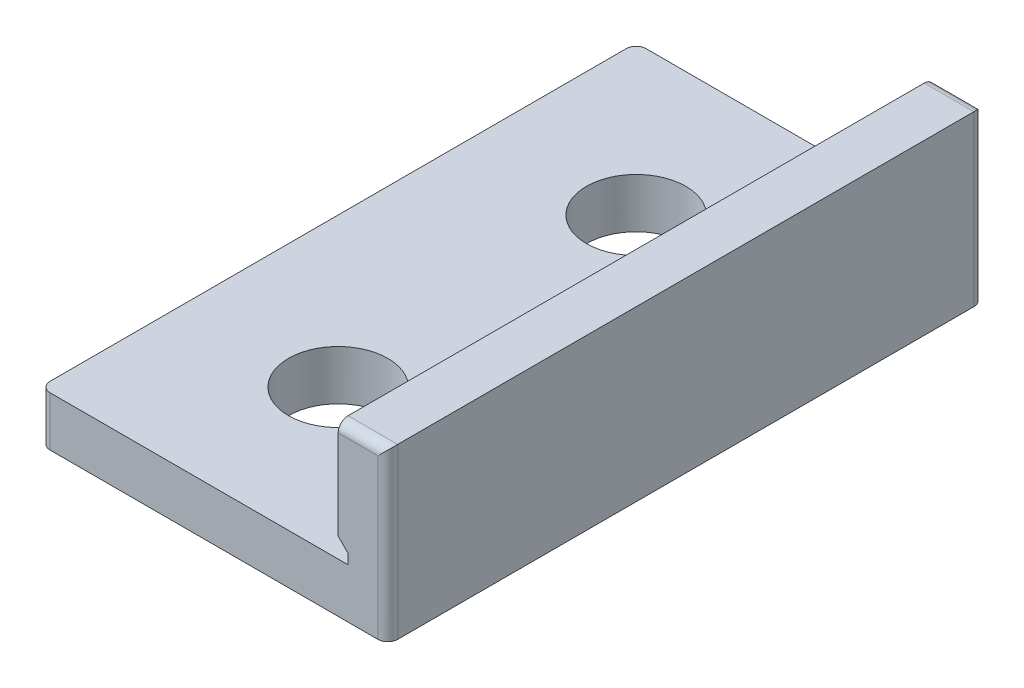
ISO-10303-21;
HEADER;
FILE_DESCRIPTION(('STEP AP214'),'2;1');
FILE_NAME('part.step','',(''),(''),'','','');
FILE_SCHEMA(('AUTOMOTIVE_DESIGN { 1 0 10303 214 1 1 1 1 }'));
ENDSEC;
DATA;
#1=APPLICATION_CONTEXT('core data for automotive mechanical design processes');
#2=APPLICATION_PROTOCOL_DEFINITION('international standard','automotive_design',2000,#1);
#3=PRODUCT_CONTEXT('',#1,'mechanical');
#4=PRODUCT('Part','Part','',(#3));
#5=PRODUCT_RELATED_PRODUCT_CATEGORY('part','',(#4));
#6=PRODUCT_DEFINITION_FORMATION('','',#4);
#7=PRODUCT_DEFINITION_CONTEXT('part definition',#1,'design');
#8=PRODUCT_DEFINITION('design','',#6,#7);
#9=PRODUCT_DEFINITION_SHAPE('','',#8);
#10=(LENGTH_UNIT() NAMED_UNIT(*) SI_UNIT(.MILLI.,.METRE.));
#11=(NAMED_UNIT(*) PLANE_ANGLE_UNIT() SI_UNIT($,.RADIAN.));
#12=(NAMED_UNIT(*) SI_UNIT($,.STERADIAN.) SOLID_ANGLE_UNIT());
#13=UNCERTAINTY_MEASURE_WITH_UNIT(LENGTH_MEASURE(1.E-05),#10,'distance_accuracy_value','');
#14=(GEOMETRIC_REPRESENTATION_CONTEXT(3) GLOBAL_UNCERTAINTY_ASSIGNED_CONTEXT((#13)) GLOBAL_UNIT_ASSIGNED_CONTEXT((#10,
#11,#12)) REPRESENTATION_CONTEXT('',''));
#15=CARTESIAN_POINT('',(0.,0.,0.));
#16=DIRECTION('',(0.,0.,1.));
#17=DIRECTION('',(1.,0.,0.));
#18=AXIS2_PLACEMENT_3D('',#15,#16,#17);
#19=CARTESIAN_POINT('',(35.,0.,30.));
#20=DIRECTION('',(-1.,0.,0.));
#21=DIRECTION('',(0.,0.,1.));
#22=AXIS2_PLACEMENT_3D('',#19,#20,#21);
#23=PLANE('',#22);
#24=DIRECTION('',(0.,0.,-1.));
#25=VECTOR('',#24,1.);
#26=CARTESIAN_POINT('',(35.,12.,30.));
#27=LINE('',#26,#25);
#28=CARTESIAN_POINT('',(35.,12.,29.));
#29=VERTEX_POINT('',#28);
#30=CARTESIAN_POINT('',(35.,12.,-29.));
#31=VERTEX_POINT('',#30);
#32=EDGE_CURVE('E187',#29,#31,#27,.T.);
#33=ORIENTED_EDGE('',*,*,#32,.F.);
#34=DIRECTION('',(0.,1.,0.));
#35=VECTOR('',#34,1.);
#36=CARTESIAN_POINT('',(35.,0.,29.));
#37=LINE('',#36,#35);
#38=CARTESIAN_POINT('',(35.,-5.,29.));
#39=VERTEX_POINT('',#38);
#40=EDGE_CURVE('E198',#29,#39,#37,.F.);
#41=ORIENTED_EDGE('',*,*,#40,.T.);
#42=DIRECTION('',(0.,0.,-1.));
#43=VECTOR('',#42,1.);
#44=CARTESIAN_POINT('',(35.,-5.,30.));
#45=LINE('',#44,#43);
#46=CARTESIAN_POINT('',(35.,-5.,-29.));
#47=VERTEX_POINT('',#46);
#48=EDGE_CURVE('E174',#39,#47,#45,.T.);
#49=ORIENTED_EDGE('',*,*,#48,.T.);
#50=DIRECTION('',(0.,1.,0.));
#51=VECTOR('',#50,1.);
#52=CARTESIAN_POINT('',(35.,12.,-29.));
#53=LINE('',#52,#51);
#54=EDGE_CURVE('E195',#47,#31,#53,.T.);
#55=ORIENTED_EDGE('',*,*,#54,.T.);
#56=EDGE_LOOP('',(#33,#41,#49,#55));
#57=FACE_BOUND('',#56,.T.);
#58=ADVANCED_FACE('F37',(#57),#23,.F.);
#59=CARTESIAN_POINT('',(30.,12.,30.));
#60=DIRECTION('',(0.,1.,0.));
#61=DIRECTION('',(0.,0.,1.));
#62=AXIS2_PLACEMENT_3D('',#59,#60,#61);
#63=PLANE('',#62);
#64=DIRECTION('',(0.,0.,-1.));
#65=VECTOR('',#64,1.);
#66=CARTESIAN_POINT('',(30.,12.,30.));
#67=LINE('',#66,#65);
#68=CARTESIAN_POINT('',(30.,12.,29.));
#69=VERTEX_POINT('',#68);
#70=CARTESIAN_POINT('',(30.,12.,-29.));
#71=VERTEX_POINT('',#70);
#72=EDGE_CURVE('E184',#69,#71,#67,.T.);
#73=ORIENTED_EDGE('',*,*,#72,.F.);
#74=DIRECTION('',(1.,0.,0.));
#75=VECTOR('',#74,1.);
#76=CARTESIAN_POINT('',(35.,12.,29.));
#77=LINE('',#76,#75);
#78=EDGE_CURVE('E217',#69,#29,#77,.T.);
#79=ORIENTED_EDGE('',*,*,#78,.T.);
#80=ORIENTED_EDGE('',*,*,#32,.T.);
#81=DIRECTION('',(1.,0.,0.));
#82=VECTOR('',#81,1.);
#83=CARTESIAN_POINT('',(30.,12.,-29.));
#84=LINE('',#83,#82);
#85=EDGE_CURVE('E215',#31,#71,#84,.F.);
#86=ORIENTED_EDGE('',*,*,#85,.T.);
#87=EDGE_LOOP('',(#73,#79,#80,#86));
#88=FACE_BOUND('',#87,.T.);
#89=ADVANCED_FACE('F251',(#88),#63,.T.);
#90=CARTESIAN_POINT('',(30.,0.,30.));
#91=DIRECTION('',(-1.,0.,0.));
#92=DIRECTION('',(0.,0.,1.));
#93=AXIS2_PLACEMENT_3D('',#90,#91,#92);
#94=PLANE('',#93);
#95=DIRECTION('',(0.,1.,0.));
#96=VECTOR('',#95,1.);
#97=CARTESIAN_POINT('',(30.,0.,30.));
#98=LINE('',#97,#96);
#99=CARTESIAN_POINT('',(30.,2.,30.));
#100=VERTEX_POINT('',#99);
#101=CARTESIAN_POINT('',(30.,11.,30.));
#102=VERTEX_POINT('',#101);
#103=EDGE_CURVE('E150',#100,#102,#98,.T.);
#104=ORIENTED_EDGE('',*,*,#103,.T.);
#105=CARTESIAN_POINT('',(30.,11.,29.));
#106=DIRECTION('',(-1.,0.,0.));
#107=DIRECTION('',(0.,0.,1.));
#108=AXIS2_PLACEMENT_3D('',#105,#106,#107);
#109=CIRCLE('',#108,1.);
#110=EDGE_CURVE('E221',#102,#69,#109,.T.);
#111=ORIENTED_EDGE('',*,*,#110,.T.);
#112=ORIENTED_EDGE('',*,*,#72,.T.);
#113=CARTESIAN_POINT('',(30.,11.,-29.));
#114=DIRECTION('',(-1.,0.,0.));
#115=DIRECTION('',(0.,0.,1.));
#116=AXIS2_PLACEMENT_3D('',#113,#114,#115);
#117=CIRCLE('',#116,1.);
#118=CARTESIAN_POINT('',(30.,11.,-30.));
#119=VERTEX_POINT('',#118);
#120=EDGE_CURVE('E219',#71,#119,#117,.T.);
#121=ORIENTED_EDGE('',*,*,#120,.T.);
#122=DIRECTION('',(0.,1.,0.));
#123=VECTOR('',#122,1.);
#124=CARTESIAN_POINT('',(30.,0.,-30.));
#125=LINE('',#124,#123);
#126=CARTESIAN_POINT('',(30.,1.99999999999999,-30.));
#127=VERTEX_POINT('',#126);
#128=EDGE_CURVE('E153',#127,#119,#125,.T.);
#129=ORIENTED_EDGE('',*,*,#128,.F.);
#130=DIRECTION('',(0.,0.,-1.));
#131=VECTOR('',#130,1.);
#132=CARTESIAN_POINT('',(30.,2.,30.001));
#133=LINE('',#132,#131);
#134=EDGE_CURVE('E136',#100,#127,#133,.T.);
#135=ORIENTED_EDGE('',*,*,#134,.F.);
#136=EDGE_LOOP('',(#104,#111,#112,#121,#129,#135));
#137=FACE_BOUND('',#136,.T.);
#138=ADVANCED_FACE('F149',(#137),#94,.T.);
#139=CARTESIAN_POINT('',(0.,0.,30.));
#140=DIRECTION('',(0.,1.,0.));
#141=DIRECTION('',(0.,0.,1.));
#142=AXIS2_PLACEMENT_3D('',#139,#140,#141);
#143=PLANE('',#142);
#144=CARTESIAN_POINT('',(15.,0.,-15.));
#145=DIRECTION('',(0.,1.,0.));
#146=DIRECTION('',(0.,0.,1.));
#147=AXIS2_PLACEMENT_3D('',#144,#145,#146);
#148=CIRCLE('',#147,5.);
#149=CARTESIAN_POINT('',(15.,0.,-10.));
#150=VERTEX_POINT('',#149);
#151=EDGE_CURVE('E287',#150,#150,#148,.T.);
#152=ORIENTED_EDGE('',*,*,#151,.F.);
#153=EDGE_LOOP('',(#152));
#154=FACE_BOUND('',#153,.T.);
#155=CARTESIAN_POINT('',(15.,0.,15.));
#156=DIRECTION('',(0.,1.,0.));
#157=DIRECTION('',(0.,0.,1.));
#158=AXIS2_PLACEMENT_3D('',#155,#156,#157);
#159=CIRCLE('',#158,5.);
#160=CARTESIAN_POINT('',(15.,0.,20.));
#161=VERTEX_POINT('',#160);
#162=EDGE_CURVE('E170',#161,#161,#159,.T.);
#163=ORIENTED_EDGE('',*,*,#162,.F.);
#164=EDGE_LOOP('',(#163));
#165=FACE_BOUND('',#164,.T.);
#166=DIRECTION('',(0.,0.,-1.));
#167=VECTOR('',#166,1.);
#168=CARTESIAN_POINT('',(0.,0.,30.));
#169=LINE('',#168,#167);
#170=CARTESIAN_POINT('',(0.,0.,29.));
#171=VERTEX_POINT('',#170);
#172=CARTESIAN_POINT('',(0.,0.,-29.));
#173=VERTEX_POINT('',#172);
#174=EDGE_CURVE('E182',#171,#173,#169,.T.);
#175=ORIENTED_EDGE('',*,*,#174,.F.);
#176=CARTESIAN_POINT('',(1.,0.,29.));
#177=DIRECTION('',(0.,1.,0.));
#178=DIRECTION('',(0.,0.,1.));
#179=AXIS2_PLACEMENT_3D('',#176,#177,#178);
#180=CIRCLE('',#179,1.);
#181=CARTESIAN_POINT('',(1.,0.,30.));
#182=VERTEX_POINT('',#181);
#183=EDGE_CURVE('E11',#171,#182,#180,.T.);
#184=ORIENTED_EDGE('',*,*,#183,.T.);
#185=DIRECTION('',(1.,0.,0.));
#186=VECTOR('',#185,1.);
#187=CARTESIAN_POINT('',(0.,0.,30.));
#188=LINE('',#187,#186);
#189=CARTESIAN_POINT('',(31.,0.,30.));
#190=VERTEX_POINT('',#189);
#191=EDGE_CURVE('E161',#182,#190,#188,.T.);
#192=ORIENTED_EDGE('',*,*,#191,.T.);
#193=DIRECTION('',(0.,0.,-1.));
#194=VECTOR('',#193,1.);
#195=CARTESIAN_POINT('',(31.,0.,30.001));
#196=LINE('',#195,#194);
#197=CARTESIAN_POINT('',(31.,0.,-30.));
#198=VERTEX_POINT('',#197);
#199=EDGE_CURVE('E144',#190,#198,#196,.T.);
#200=ORIENTED_EDGE('',*,*,#199,.T.);
#201=DIRECTION('',(1.,0.,0.));
#202=VECTOR('',#201,1.);
#203=CARTESIAN_POINT('',(0.,0.,-30.));
#204=LINE('',#203,#202);
#205=CARTESIAN_POINT('',(1.,0.,-30.));
#206=VERTEX_POINT('',#205);
#207=EDGE_CURVE('E167',#206,#198,#204,.T.);
#208=ORIENTED_EDGE('',*,*,#207,.F.);
#209=CARTESIAN_POINT('',(1.,0.,-29.));
#210=DIRECTION('',(0.,1.,0.));
#211=DIRECTION('',(0.,0.,1.));
#212=AXIS2_PLACEMENT_3D('',#209,#210,#211);
#213=CIRCLE('',#212,1.);
#214=EDGE_CURVE('E46',#206,#173,#213,.T.);
#215=ORIENTED_EDGE('',*,*,#214,.T.);
#216=EDGE_LOOP('',(#175,#184,#192,#200,#208,#215));
#217=FACE_BOUND('',#216,.T.);
#218=ADVANCED_FACE('F272',(#154,#165,#217),#143,.T.);
#219=CARTESIAN_POINT('',(0.,-5.,30.));
#220=DIRECTION('',(-1.,0.,0.));
#221=DIRECTION('',(0.,0.,1.));
#222=AXIS2_PLACEMENT_3D('',#219,#220,#221);
#223=PLANE('',#222);
#224=DIRECTION('',(0.,0.,-1.));
#225=VECTOR('',#224,1.);
#226=CARTESIAN_POINT('',(0.,-5.,30.));
#227=LINE('',#226,#225);
#228=CARTESIAN_POINT('',(0.,-5.,29.));
#229=VERTEX_POINT('',#228);
#230=CARTESIAN_POINT('',(0.,-5.,-29.));
#231=VERTEX_POINT('',#230);
#232=EDGE_CURVE('E179',#229,#231,#227,.T.);
#233=ORIENTED_EDGE('',*,*,#232,.F.);
#234=DIRECTION('',(0.,1.,0.));
#235=VECTOR('',#234,1.);
#236=CARTESIAN_POINT('',(0.,0.,29.));
#237=LINE('',#236,#235);
#238=EDGE_CURVE('E225',#229,#171,#237,.T.);
#239=ORIENTED_EDGE('',*,*,#238,.T.);
#240=ORIENTED_EDGE('',*,*,#174,.T.);
#241=DIRECTION('',(0.,1.,0.));
#242=VECTOR('',#241,1.);
#243=CARTESIAN_POINT('',(0.,-5.,-29.));
#244=LINE('',#243,#242);
#245=EDGE_CURVE('E223',#173,#231,#244,.F.);
#246=ORIENTED_EDGE('',*,*,#245,.T.);
#247=EDGE_LOOP('',(#233,#239,#240,#246));
#248=FACE_BOUND('',#247,.T.);
#249=ADVANCED_FACE('F270',(#248),#223,.T.);
#250=CARTESIAN_POINT('',(0.,-5.,30.));
#251=DIRECTION('',(0.,1.,0.));
#252=DIRECTION('',(0.,0.,1.));
#253=AXIS2_PLACEMENT_3D('',#250,#251,#252);
#254=PLANE('',#253);
#255=CARTESIAN_POINT('',(15.,-5.,-15.));
#256=DIRECTION('',(0.,-1.,0.));
#257=DIRECTION('',(0.,0.,-1.));
#258=AXIS2_PLACEMENT_3D('',#255,#256,#257);
#259=CIRCLE('',#258,5.);
#260=CARTESIAN_POINT('',(15.,-5.,-20.));
#261=VERTEX_POINT('',#260);
#262=EDGE_CURVE('E143',#261,#261,#259,.T.);
#263=ORIENTED_EDGE('',*,*,#262,.F.);
#264=EDGE_LOOP('',(#263));
#265=FACE_BOUND('',#264,.T.);
#266=CARTESIAN_POINT('',(15.,-5.,15.));
#267=DIRECTION('',(0.,-1.,0.));
#268=DIRECTION('',(0.,0.,-1.));
#269=AXIS2_PLACEMENT_3D('',#266,#267,#268);
#270=CIRCLE('',#269,5.);
#271=CARTESIAN_POINT('',(15.,-5.,10.));
#272=VERTEX_POINT('',#271);
#273=EDGE_CURVE('E289',#272,#272,#270,.T.);
#274=ORIENTED_EDGE('',*,*,#273,.F.);
#275=EDGE_LOOP('',(#274));
#276=FACE_BOUND('',#275,.T.);
#277=ORIENTED_EDGE('',*,*,#48,.F.);
#278=CARTESIAN_POINT('',(34.,-5.,29.));
#279=DIRECTION('',(0.,1.,0.));
#280=DIRECTION('',(0.,0.,1.));
#281=AXIS2_PLACEMENT_3D('',#278,#279,#280);
#282=CIRCLE('',#281,1.);
#283=CARTESIAN_POINT('',(34.,-5.,30.));
#284=VERTEX_POINT('',#283);
#285=EDGE_CURVE('E206',#39,#284,#282,.F.);
#286=ORIENTED_EDGE('',*,*,#285,.T.);
#287=DIRECTION('',(1.,0.,0.));
#288=VECTOR('',#287,1.);
#289=CARTESIAN_POINT('',(0.,-5.,30.));
#290=LINE('',#289,#288);
#291=CARTESIAN_POINT('',(1.,-5.,30.));
#292=VERTEX_POINT('',#291);
#293=EDGE_CURVE('E164',#292,#284,#290,.T.);
#294=ORIENTED_EDGE('',*,*,#293,.F.);
#295=CARTESIAN_POINT('',(1.,-5.,29.));
#296=DIRECTION('',(0.,1.,0.));
#297=DIRECTION('',(0.,0.,1.));
#298=AXIS2_PLACEMENT_3D('',#295,#296,#297);
#299=CIRCLE('',#298,1.);
#300=EDGE_CURVE('E202',#292,#229,#299,.F.);
#301=ORIENTED_EDGE('',*,*,#300,.T.);
#302=ORIENTED_EDGE('',*,*,#232,.T.);
#303=CARTESIAN_POINT('',(1.,-5.,-29.));
#304=DIRECTION('',(0.,1.,0.));
#305=DIRECTION('',(0.,0.,1.));
#306=AXIS2_PLACEMENT_3D('',#303,#304,#305);
#307=CIRCLE('',#306,1.);
#308=CARTESIAN_POINT('',(1.,-5.,-30.));
#309=VERTEX_POINT('',#308);
#310=EDGE_CURVE('E200',#231,#309,#307,.F.);
#311=ORIENTED_EDGE('',*,*,#310,.T.);
#312=DIRECTION('',(1.,0.,0.));
#313=VECTOR('',#312,1.);
#314=CARTESIAN_POINT('',(0.,-5.,-30.));
#315=LINE('',#314,#313);
#316=CARTESIAN_POINT('',(34.,-5.,-30.));
#317=VERTEX_POINT('',#316);
#318=EDGE_CURVE('E162',#309,#317,#315,.T.);
#319=ORIENTED_EDGE('',*,*,#318,.T.);
#320=CARTESIAN_POINT('',(34.,-5.,-29.));
#321=DIRECTION('',(0.,1.,0.));
#322=DIRECTION('',(0.,0.,1.));
#323=AXIS2_PLACEMENT_3D('',#320,#321,#322);
#324=CIRCLE('',#323,1.);
#325=EDGE_CURVE('E204',#317,#47,#324,.F.);
#326=ORIENTED_EDGE('',*,*,#325,.T.);
#327=EDGE_LOOP('',(#277,#286,#294,#301,#302,#311,#319,#326));
#328=FACE_BOUND('',#327,.T.);
#329=ADVANCED_FACE('F259',(#265,#276,#328),#254,.F.);
#330=CARTESIAN_POINT('',(0.,0.,30.));
#331=DIRECTION('',(0.,0.,-1.));
#332=DIRECTION('',(-1.,0.,0.));
#333=AXIS2_PLACEMENT_3D('',#330,#331,#332);
#334=PLANE('',#333);
#335=ORIENTED_EDGE('',*,*,#293,.T.);
#336=DIRECTION('',(0.,1.,0.));
#337=VECTOR('',#336,1.);
#338=CARTESIAN_POINT('',(34.,0.,30.));
#339=LINE('',#338,#337);
#340=CARTESIAN_POINT('',(34.,11.,30.));
#341=VERTEX_POINT('',#340);
#342=EDGE_CURVE('E193',#284,#341,#339,.T.);
#343=ORIENTED_EDGE('',*,*,#342,.T.);
#344=DIRECTION('',(1.,0.,0.));
#345=VECTOR('',#344,1.);
#346=CARTESIAN_POINT('',(30.,11.,30.));
#347=LINE('',#346,#345);
#348=EDGE_CURVE('E160',#341,#102,#347,.F.);
#349=ORIENTED_EDGE('',*,*,#348,.T.);
#350=ORIENTED_EDGE('',*,*,#103,.F.);
#351=DIRECTION('',(-0.707106781186549,0.707106781186546,0.));
#352=VECTOR('',#351,1.);
#353=CARTESIAN_POINT('',(31.,1.,30.));
#354=LINE('',#353,#352);
#355=CARTESIAN_POINT('',(31.,1.,30.));
#356=VERTEX_POINT('',#355);
#357=EDGE_CURVE('E132',#356,#100,#354,.T.);
#358=ORIENTED_EDGE('',*,*,#357,.F.);
#359=DIRECTION('',(0.,1.,0.));
#360=VECTOR('',#359,1.);
#361=CARTESIAN_POINT('',(31.,0.,30.));
#362=LINE('',#361,#360);
#363=EDGE_CURVE('E228',#190,#356,#362,.T.);
#364=ORIENTED_EDGE('',*,*,#363,.F.);
#365=ORIENTED_EDGE('',*,*,#191,.F.);
#366=DIRECTION('',(0.,1.,0.));
#367=VECTOR('',#366,1.);
#368=CARTESIAN_POINT('',(1.,-5.,30.));
#369=LINE('',#368,#367);
#370=EDGE_CURVE('E190',#182,#292,#369,.F.);
#371=ORIENTED_EDGE('',*,*,#370,.T.);
#372=EDGE_LOOP('',(#335,#343,#349,#350,#358,#364,#365,#371));
#373=FACE_BOUND('',#372,.T.);
#374=ADVANCED_FACE('F157',(#373),#334,.F.);
#375=CARTESIAN_POINT('',(0.,0.,-30.));
#376=DIRECTION('',(0.,0.,-1.));
#377=DIRECTION('',(-1.,0.,0.));
#378=AXIS2_PLACEMENT_3D('',#375,#376,#377);
#379=PLANE('',#378);
#380=DIRECTION('',(1.,0.,0.));
#381=VECTOR('',#380,1.);
#382=CARTESIAN_POINT('',(0.,11.,-30.));
#383=LINE('',#382,#381);
#384=CARTESIAN_POINT('',(34.,11.,-30.));
#385=VERTEX_POINT('',#384);
#386=EDGE_CURVE('E211',#119,#385,#383,.T.);
#387=ORIENTED_EDGE('',*,*,#386,.T.);
#388=DIRECTION('',(0.,1.,0.));
#389=VECTOR('',#388,1.);
#390=CARTESIAN_POINT('',(34.,-5.,-30.));
#391=LINE('',#390,#389);
#392=EDGE_CURVE('E213',#385,#317,#391,.F.);
#393=ORIENTED_EDGE('',*,*,#392,.T.);
#394=ORIENTED_EDGE('',*,*,#318,.F.);
#395=DIRECTION('',(0.,1.,0.));
#396=VECTOR('',#395,1.);
#397=CARTESIAN_POINT('',(1.,0.,-30.));
#398=LINE('',#397,#396);
#399=EDGE_CURVE('E208',#309,#206,#398,.T.);
#400=ORIENTED_EDGE('',*,*,#399,.T.);
#401=ORIENTED_EDGE('',*,*,#207,.T.);
#402=DIRECTION('',(0.,-1.,0.));
#403=VECTOR('',#402,1.);
#404=CARTESIAN_POINT('',(31.,0.,-30.));
#405=LINE('',#404,#403);
#406=CARTESIAN_POINT('',(31.,1.,-30.));
#407=VERTEX_POINT('',#406);
#408=EDGE_CURVE('E154',#407,#198,#405,.T.);
#409=ORIENTED_EDGE('',*,*,#408,.F.);
#410=DIRECTION('',(0.707106781186549,-0.707106781186546,0.));
#411=VECTOR('',#410,1.);
#412=CARTESIAN_POINT('',(31.,1.,-30.));
#413=LINE('',#412,#411);
#414=EDGE_CURVE('E233',#127,#407,#413,.T.);
#415=ORIENTED_EDGE('',*,*,#414,.F.);
#416=ORIENTED_EDGE('',*,*,#128,.T.);
#417=EDGE_LOOP('',(#387,#393,#394,#400,#401,#409,#415,#416));
#418=FACE_BOUND('',#417,.T.);
#419=ADVANCED_FACE('F265',(#418),#379,.T.);
#420=CARTESIAN_POINT('',(15.,-5.,15.));
#421=DIRECTION('',(0.,-1.,0.));
#422=DIRECTION('',(0.,0.,-1.));
#423=AXIS2_PLACEMENT_3D('',#420,#421,#422);
#424=CYLINDRICAL_SURFACE('',#423,5.);
#425=ORIENTED_EDGE('',*,*,#162,.T.);
#426=EDGE_LOOP('',(#425));
#427=FACE_BOUND('',#426,.T.);
#428=ORIENTED_EDGE('',*,*,#273,.T.);
#429=EDGE_LOOP('',(#428));
#430=FACE_BOUND('',#429,.T.);
#431=ADVANCED_FACE('F296',(#427,#430),#424,.F.);
#432=CARTESIAN_POINT('',(15.,-5.,-15.));
#433=DIRECTION('',(0.,-1.,0.));
#434=DIRECTION('',(0.,0.,-1.));
#435=AXIS2_PLACEMENT_3D('',#432,#433,#434);
#436=CYLINDRICAL_SURFACE('',#435,5.);
#437=ORIENTED_EDGE('',*,*,#151,.T.);
#438=EDGE_LOOP('',(#437));
#439=FACE_BOUND('',#438,.T.);
#440=ORIENTED_EDGE('',*,*,#262,.T.);
#441=EDGE_LOOP('',(#440));
#442=FACE_BOUND('',#441,.T.);
#443=ADVANCED_FACE('F442',(#439,#442),#436,.F.);
#444=CARTESIAN_POINT('',(31.,0.,30.001));
#445=DIRECTION('',(1.,0.,0.));
#446=DIRECTION('',(0.,0.,-1.));
#447=AXIS2_PLACEMENT_3D('',#444,#445,#446);
#448=PLANE('',#447);
#449=ORIENTED_EDGE('',*,*,#363,.T.);
#450=DIRECTION('',(0.,0.,-1.));
#451=VECTOR('',#450,1.);
#452=CARTESIAN_POINT('',(31.,1.,30.001));
#453=LINE('',#452,#451);
#454=EDGE_CURVE('E138',#356,#407,#453,.T.);
#455=ORIENTED_EDGE('',*,*,#454,.T.);
#456=ORIENTED_EDGE('',*,*,#408,.T.);
#457=ORIENTED_EDGE('',*,*,#199,.F.);
#458=EDGE_LOOP('',(#449,#455,#456,#457));
#459=FACE_BOUND('',#458,.T.);
#460=ADVANCED_FACE('F277',(#459),#448,.F.);
#461=CARTESIAN_POINT('',(31.,1.,30.001));
#462=DIRECTION('',(0.707106781186546,0.707106781186549,0.));
#463=DIRECTION('',(-0.707106781186549,0.707106781186546,0.));
#464=AXIS2_PLACEMENT_3D('',#461,#462,#463);
#465=PLANE('',#464);
#466=ORIENTED_EDGE('',*,*,#357,.T.);
#467=ORIENTED_EDGE('',*,*,#134,.T.);
#468=ORIENTED_EDGE('',*,*,#414,.T.);
#469=ORIENTED_EDGE('',*,*,#454,.F.);
#470=EDGE_LOOP('',(#466,#467,#468,#469));
#471=FACE_BOUND('',#470,.T.);
#472=ADVANCED_FACE('F134',(#471),#465,.F.);
#473=CARTESIAN_POINT('',(30.,11.,29.));
#474=DIRECTION('',(-1.,0.,0.));
#475=DIRECTION('',(0.,0.,1.));
#476=AXIS2_PLACEMENT_3D('',#473,#474,#475);
#477=CYLINDRICAL_SURFACE('',#476,1.);
#478=ORIENTED_EDGE('',*,*,#110,.F.);
#479=ORIENTED_EDGE('',*,*,#348,.F.);
#480=CARTESIAN_POINT('',(34.,11.,29.));
#481=DIRECTION('',(-0.707106781186547,0.707106781186547,0.));
#482=DIRECTION('',(-0.707106781186547,-0.707106781186547,0.));
#483=AXIS2_PLACEMENT_3D('',#480,#481,#482);
#484=ELLIPSE('',#483,1.41421356237309,1.);
#485=EDGE_CURVE('E227',#29,#341,#484,.F.);
#486=ORIENTED_EDGE('',*,*,#485,.F.);
#487=ORIENTED_EDGE('',*,*,#78,.F.);
#488=EDGE_LOOP('',(#478,#479,#486,#487));
#489=FACE_BOUND('',#488,.T.);
#490=ADVANCED_FACE('F254',(#489),#477,.T.);
#491=CARTESIAN_POINT('',(34.,0.,29.));
#492=DIRECTION('',(0.,1.,0.));
#493=DIRECTION('',(0.,0.,1.));
#494=AXIS2_PLACEMENT_3D('',#491,#492,#493);
#495=CYLINDRICAL_SURFACE('',#494,1.);
#496=ORIENTED_EDGE('',*,*,#285,.F.);
#497=ORIENTED_EDGE('',*,*,#40,.F.);
#498=ORIENTED_EDGE('',*,*,#485,.T.);
#499=ORIENTED_EDGE('',*,*,#342,.F.);
#500=EDGE_LOOP('',(#496,#497,#498,#499));
#501=FACE_BOUND('',#500,.T.);
#502=ADVANCED_FACE('F257',(#501),#495,.T.);
#503=CARTESIAN_POINT('',(0.,11.,-29.));
#504=DIRECTION('',(1.,0.,0.));
#505=DIRECTION('',(0.,0.,-1.));
#506=AXIS2_PLACEMENT_3D('',#503,#504,#505);
#507=CYLINDRICAL_SURFACE('',#506,1.);
#508=ORIENTED_EDGE('',*,*,#120,.F.);
#509=ORIENTED_EDGE('',*,*,#85,.F.);
#510=CARTESIAN_POINT('',(34.,11.,-29.));
#511=DIRECTION('',(0.707106781186547,-0.707106781186547,0.));
#512=DIRECTION('',(0.707106781186547,0.707106781186547,0.));
#513=AXIS2_PLACEMENT_3D('',#510,#511,#512);
#514=ELLIPSE('',#513,1.41421356237309,1.);
#515=EDGE_CURVE('E41',#385,#31,#514,.T.);
#516=ORIENTED_EDGE('',*,*,#515,.F.);
#517=ORIENTED_EDGE('',*,*,#386,.F.);
#518=EDGE_LOOP('',(#508,#509,#516,#517));
#519=FACE_BOUND('',#518,.T.);
#520=ADVANCED_FACE('F245',(#519),#507,.T.);
#521=CARTESIAN_POINT('',(34.,0.,-29.));
#522=DIRECTION('',(0.,-1.,0.));
#523=DIRECTION('',(0.,0.,-1.));
#524=AXIS2_PLACEMENT_3D('',#521,#522,#523);
#525=CYLINDRICAL_SURFACE('',#524,1.);
#526=ORIENTED_EDGE('',*,*,#325,.F.);
#527=ORIENTED_EDGE('',*,*,#392,.F.);
#528=ORIENTED_EDGE('',*,*,#515,.T.);
#529=ORIENTED_EDGE('',*,*,#54,.F.);
#530=EDGE_LOOP('',(#526,#527,#528,#529));
#531=FACE_BOUND('',#530,.T.);
#532=ADVANCED_FACE('F241',(#531),#525,.T.);
#533=CARTESIAN_POINT('',(1.,-5.,29.));
#534=DIRECTION('',(0.,-1.,0.));
#535=DIRECTION('',(0.,0.,-1.));
#536=AXIS2_PLACEMENT_3D('',#533,#534,#535);
#537=CYLINDRICAL_SURFACE('',#536,1.);
#538=ORIENTED_EDGE('',*,*,#300,.F.);
#539=ORIENTED_EDGE('',*,*,#370,.F.);
#540=ORIENTED_EDGE('',*,*,#183,.F.);
#541=ORIENTED_EDGE('',*,*,#238,.F.);
#542=EDGE_LOOP('',(#538,#539,#540,#541));
#543=FACE_BOUND('',#542,.T.);
#544=ADVANCED_FACE('F271',(#543),#537,.T.);
#545=CARTESIAN_POINT('',(1.,0.,-29.));
#546=DIRECTION('',(0.,1.,0.));
#547=DIRECTION('',(0.,0.,1.));
#548=AXIS2_PLACEMENT_3D('',#545,#546,#547);
#549=CYLINDRICAL_SURFACE('',#548,1.);
#550=ORIENTED_EDGE('',*,*,#310,.F.);
#551=ORIENTED_EDGE('',*,*,#245,.F.);
#552=ORIENTED_EDGE('',*,*,#214,.F.);
#553=ORIENTED_EDGE('',*,*,#399,.F.);
#554=EDGE_LOOP('',(#550,#551,#552,#553));
#555=FACE_BOUND('',#554,.T.);
#556=ADVANCED_FACE('F39',(#555),#549,.T.);
#557=CLOSED_SHELL('',(#58,#89,#138,#218,#249,#329,#374,#419,#431,#443,#460,#472,#490,#502,#520,
#532,#544,#556));
#558=MANIFOLD_SOLID_BREP('B2',#557);
#559=ADVANCED_BREP_SHAPE_REPRESENTATION('',(#18,#558),#14);
#560=SHAPE_DEFINITION_REPRESENTATION(#9,#559);
ENDSEC;
END-ISO-10303-21;
